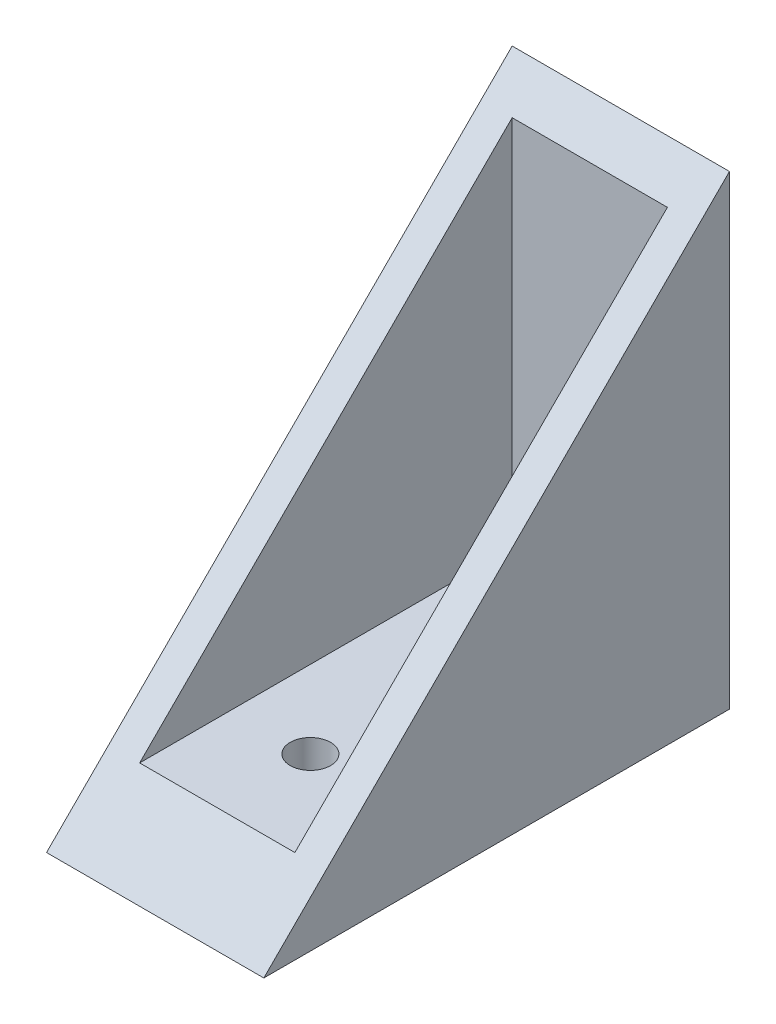
ISO-10303-21;
HEADER;
FILE_DESCRIPTION(('STEP AP214'),'2;1');
FILE_NAME('part.step','',(''),(''),'','','');
FILE_SCHEMA(('AUTOMOTIVE_DESIGN { 1 0 10303 214 1 1 1 1 }'));
ENDSEC;
DATA;
#1=APPLICATION_CONTEXT('core data for automotive mechanical design processes');
#2=APPLICATION_PROTOCOL_DEFINITION('international standard','automotive_design',2000,#1);
#3=PRODUCT_CONTEXT('',#1,'mechanical');
#4=PRODUCT('Part','Part','',(#3));
#5=PRODUCT_RELATED_PRODUCT_CATEGORY('part','',(#4));
#6=PRODUCT_DEFINITION_FORMATION('','',#4);
#7=PRODUCT_DEFINITION_CONTEXT('part definition',#1,'design');
#8=PRODUCT_DEFINITION('design','',#6,#7);
#9=PRODUCT_DEFINITION_SHAPE('','',#8);
#10=(LENGTH_UNIT() NAMED_UNIT(*) SI_UNIT(.MILLI.,.METRE.));
#11=(NAMED_UNIT(*) PLANE_ANGLE_UNIT() SI_UNIT($,.RADIAN.));
#12=(NAMED_UNIT(*) SI_UNIT($,.STERADIAN.) SOLID_ANGLE_UNIT());
#13=UNCERTAINTY_MEASURE_WITH_UNIT(LENGTH_MEASURE(1.E-05),#10,'distance_accuracy_value','');
#14=(GEOMETRIC_REPRESENTATION_CONTEXT(3) GLOBAL_UNCERTAINTY_ASSIGNED_CONTEXT((#13)) GLOBAL_UNIT_ASSIGNED_CONTEXT((#10,
#11,#12)) REPRESENTATION_CONTEXT('',''));
#15=CARTESIAN_POINT('',(0.,0.,0.));
#16=DIRECTION('',(0.,0.,1.));
#17=DIRECTION('',(1.,0.,0.));
#18=AXIS2_PLACEMENT_3D('',#15,#16,#17);
#19=CARTESIAN_POINT('',(17.5,75.,0.));
#20=DIRECTION('',(0.,-0.707106781186548,-0.707106781186548));
#21=DIRECTION('',(0.,0.707106781186548,-0.707106781186548));
#22=AXIS2_PLACEMENT_3D('',#19,#20,#21);
#23=PLANE('',#22);
#24=DIRECTION('',(0.,-0.707106781186548,0.707106781186548));
#25=VECTOR('',#24,1.);
#26=CARTESIAN_POINT('',(-17.5,75.,0.));
#27=LINE('',#26,#25);
#28=CARTESIAN_POINT('',(-17.5,75.,0.));
#29=VERTEX_POINT('',#28);
#30=CARTESIAN_POINT('',(-17.5,0.,75.));
#31=VERTEX_POINT('',#30);
#32=EDGE_CURVE('E80',#29,#31,#27,.T.);
#33=ORIENTED_EDGE('',*,*,#32,.T.);
#34=DIRECTION('',(-1.,0.,0.));
#35=VECTOR('',#34,1.);
#36=CARTESIAN_POINT('',(17.5,0.,75.));
#37=LINE('',#36,#35);
#38=CARTESIAN_POINT('',(17.5,0.,75.));
#39=VERTEX_POINT('',#38);
#40=EDGE_CURVE('E129',#39,#31,#37,.T.);
#41=ORIENTED_EDGE('',*,*,#40,.F.);
#42=DIRECTION('',(0.,-0.707106781186548,0.707106781186548));
#43=VECTOR('',#42,1.);
#44=CARTESIAN_POINT('',(17.5,75.,0.));
#45=LINE('',#44,#43);
#46=CARTESIAN_POINT('',(17.5,75.,0.));
#47=VERTEX_POINT('',#46);
#48=EDGE_CURVE('E63',#47,#39,#45,.T.);
#49=ORIENTED_EDGE('',*,*,#48,.F.);
#50=DIRECTION('',(-1.,0.,0.));
#51=VECTOR('',#50,1.);
#52=CARTESIAN_POINT('',(17.5,75.,0.));
#53=LINE('',#52,#51);
#54=EDGE_CURVE('E136',#47,#29,#53,.T.);
#55=ORIENTED_EDGE('',*,*,#54,.T.);
#56=EDGE_LOOP('',(#33,#41,#49,#55));
#57=FACE_BOUND('',#56,.T.);
#58=DIRECTION('',(-1.,0.,0.));
#59=VECTOR('',#58,1.);
#60=CARTESIAN_POINT('',(17.5,70.,4.99999999999999));
#61=LINE('',#60,#59);
#62=CARTESIAN_POINT('',(12.5,70.,4.99999999999999));
#63=VERTEX_POINT('',#62);
#64=CARTESIAN_POINT('',(-12.5,70.,4.99999999999999));
#65=VERTEX_POINT('',#64);
#66=EDGE_CURVE('E11',#63,#65,#61,.T.);
#67=ORIENTED_EDGE('',*,*,#66,.F.);
#68=DIRECTION('',(0.,0.707106781186548,-0.707106781186548));
#69=VECTOR('',#68,1.);
#70=CARTESIAN_POINT('',(12.5,75.,0.));
#71=LINE('',#70,#69);
#72=CARTESIAN_POINT('',(12.5,10.,65.));
#73=VERTEX_POINT('',#72);
#74=EDGE_CURVE('E107',#73,#63,#71,.T.);
#75=ORIENTED_EDGE('',*,*,#74,.F.);
#76=DIRECTION('',(-1.,0.,0.));
#77=VECTOR('',#76,1.);
#78=CARTESIAN_POINT('',(17.5,9.99999999999999,65.));
#79=LINE('',#78,#77);
#80=CARTESIAN_POINT('',(-12.5,9.99999999999999,65.));
#81=VERTEX_POINT('',#80);
#82=EDGE_CURVE('E117',#73,#81,#79,.T.);
#83=ORIENTED_EDGE('',*,*,#82,.T.);
#84=DIRECTION('',(0.,-0.707106781186548,0.707106781186548));
#85=VECTOR('',#84,1.);
#86=CARTESIAN_POINT('',(-12.5,75.,0.));
#87=LINE('',#86,#85);
#88=EDGE_CURVE('E47',#65,#81,#87,.T.);
#89=ORIENTED_EDGE('',*,*,#88,.F.);
#90=EDGE_LOOP('',(#67,#75,#83,#89));
#91=FACE_BOUND('',#90,.T.);
#92=ADVANCED_FACE('F39',(#57,#91),#23,.F.);
#93=CARTESIAN_POINT('',(17.5,0.,75.));
#94=DIRECTION('',(0.,1.,0.));
#95=DIRECTION('',(0.,0.,1.));
#96=AXIS2_PLACEMENT_3D('',#93,#94,#95);
#97=PLANE('',#96);
#98=CARTESIAN_POINT('',(0.,0.,20.));
#99=DIRECTION('',(0.,1.,0.));
#100=DIRECTION('',(0.,0.,1.));
#101=AXIS2_PLACEMENT_3D('',#98,#99,#100);
#102=CIRCLE('',#101,3.25);
#103=CARTESIAN_POINT('',(0.,0.,23.25));
#104=VERTEX_POINT('',#103);
#105=EDGE_CURVE('E192',#104,#104,#102,.T.);
#106=ORIENTED_EDGE('',*,*,#105,.T.);
#107=EDGE_LOOP('',(#106));
#108=FACE_BOUND('',#107,.T.);
#109=CARTESIAN_POINT('',(0.,0.,50.));
#110=DIRECTION('',(0.,1.,0.));
#111=DIRECTION('',(0.,0.,1.));
#112=AXIS2_PLACEMENT_3D('',#109,#110,#111);
#113=CIRCLE('',#112,3.25);
#114=CARTESIAN_POINT('',(0.,0.,53.25));
#115=VERTEX_POINT('',#114);
#116=EDGE_CURVE('E202',#115,#115,#113,.T.);
#117=ORIENTED_EDGE('',*,*,#116,.T.);
#118=EDGE_LOOP('',(#117));
#119=FACE_BOUND('',#118,.T.);
#120=DIRECTION('',(0.,0.,-1.));
#121=VECTOR('',#120,1.);
#122=CARTESIAN_POINT('',(-17.5,0.,75.));
#123=LINE('',#122,#121);
#124=CARTESIAN_POINT('',(-17.5,0.,0.));
#125=VERTEX_POINT('',#124);
#126=EDGE_CURVE('E111',#31,#125,#123,.T.);
#127=ORIENTED_EDGE('',*,*,#126,.T.);
#128=DIRECTION('',(-1.,0.,0.));
#129=VECTOR('',#128,1.);
#130=CARTESIAN_POINT('',(17.5,0.,0.));
#131=LINE('',#130,#129);
#132=CARTESIAN_POINT('',(17.5,0.,0.));
#133=VERTEX_POINT('',#132);
#134=EDGE_CURVE('E138',#133,#125,#131,.T.);
#135=ORIENTED_EDGE('',*,*,#134,.F.);
#136=DIRECTION('',(0.,0.,-1.));
#137=VECTOR('',#136,1.);
#138=CARTESIAN_POINT('',(17.5,0.,75.));
#139=LINE('',#138,#137);
#140=EDGE_CURVE('E125',#39,#133,#139,.T.);
#141=ORIENTED_EDGE('',*,*,#140,.F.);
#142=ORIENTED_EDGE('',*,*,#40,.T.);
#143=EDGE_LOOP('',(#127,#135,#141,#142));
#144=FACE_BOUND('',#143,.T.);
#145=ADVANCED_FACE('F41',(#108,#119,#144),#97,.F.);
#146=CARTESIAN_POINT('',(17.5,0.,0.));
#147=DIRECTION('',(0.,0.,1.));
#148=DIRECTION('',(1.,0.,0.));
#149=AXIS2_PLACEMENT_3D('',#146,#147,#148);
#150=PLANE('',#149);
#151=DIRECTION('',(0.,1.,0.));
#152=VECTOR('',#151,1.);
#153=CARTESIAN_POINT('',(-17.5,0.,0.));
#154=LINE('',#153,#152);
#155=EDGE_CURVE('E132',#125,#29,#154,.T.);
#156=ORIENTED_EDGE('',*,*,#155,.T.);
#157=ORIENTED_EDGE('',*,*,#54,.F.);
#158=DIRECTION('',(0.,1.,0.));
#159=VECTOR('',#158,1.);
#160=CARTESIAN_POINT('',(17.5,0.,0.));
#161=LINE('',#160,#159);
#162=EDGE_CURVE('E86',#133,#47,#161,.T.);
#163=ORIENTED_EDGE('',*,*,#162,.F.);
#164=ORIENTED_EDGE('',*,*,#134,.T.);
#165=EDGE_LOOP('',(#156,#157,#163,#164));
#166=FACE_BOUND('',#165,.T.);
#167=ADVANCED_FACE('F152',(#166),#150,.F.);
#168=CARTESIAN_POINT('',(17.5,0.,0.));
#169=DIRECTION('',(1.,0.,0.));
#170=DIRECTION('',(0.,0.,-1.));
#171=AXIS2_PLACEMENT_3D('',#168,#169,#170);
#172=PLANE('',#171);
#173=ORIENTED_EDGE('',*,*,#140,.T.);
#174=ORIENTED_EDGE('',*,*,#162,.T.);
#175=ORIENTED_EDGE('',*,*,#48,.T.);
#176=EDGE_LOOP('',(#173,#174,#175));
#177=FACE_BOUND('',#176,.T.);
#178=ADVANCED_FACE('F158',(#177),#172,.T.);
#179=CARTESIAN_POINT('',(-17.5,0.,0.));
#180=DIRECTION('',(1.,0.,0.));
#181=DIRECTION('',(0.,0.,-1.));
#182=AXIS2_PLACEMENT_3D('',#179,#180,#181);
#183=PLANE('',#182);
#184=ORIENTED_EDGE('',*,*,#126,.F.);
#185=ORIENTED_EDGE('',*,*,#32,.F.);
#186=ORIENTED_EDGE('',*,*,#155,.F.);
#187=EDGE_LOOP('',(#184,#185,#186));
#188=FACE_BOUND('',#187,.T.);
#189=ADVANCED_FACE('F155',(#188),#183,.F.);
#190=CARTESIAN_POINT('',(-12.5,75.,75.));
#191=DIRECTION('',(1.,0.,0.));
#192=DIRECTION('',(0.,0.,-1.));
#193=AXIS2_PLACEMENT_3D('',#190,#191,#192);
#194=PLANE('',#193);
#195=ORIENTED_EDGE('',*,*,#88,.T.);
#196=DIRECTION('',(0.,0.,1.));
#197=VECTOR('',#196,1.);
#198=CARTESIAN_POINT('',(-12.5,10.,75.));
#199=LINE('',#198,#197);
#200=CARTESIAN_POINT('',(-12.5,10.,4.99999999999999));
#201=VERTEX_POINT('',#200);
#202=EDGE_CURVE('E54',#201,#81,#199,.T.);
#203=ORIENTED_EDGE('',*,*,#202,.F.);
#204=DIRECTION('',(0.,-1.,0.));
#205=VECTOR('',#204,1.);
#206=CARTESIAN_POINT('',(-12.5,75.,4.99999999999999));
#207=LINE('',#206,#205);
#208=EDGE_CURVE('E112',#65,#201,#207,.T.);
#209=ORIENTED_EDGE('',*,*,#208,.F.);
#210=EDGE_LOOP('',(#195,#203,#209));
#211=FACE_BOUND('',#210,.T.);
#212=ADVANCED_FACE('F143',(#211),#194,.T.);
#213=CARTESIAN_POINT('',(12.5,75.,75.));
#214=DIRECTION('',(-1.,0.,0.));
#215=DIRECTION('',(0.,0.,1.));
#216=AXIS2_PLACEMENT_3D('',#213,#214,#215);
#217=PLANE('',#216);
#218=ORIENTED_EDGE('',*,*,#74,.T.);
#219=DIRECTION('',(0.,-1.,0.));
#220=VECTOR('',#219,1.);
#221=CARTESIAN_POINT('',(12.5,75.,4.99999999999999));
#222=LINE('',#221,#220);
#223=CARTESIAN_POINT('',(12.5,10.,4.99999999999999));
#224=VERTEX_POINT('',#223);
#225=EDGE_CURVE('E102',#63,#224,#222,.T.);
#226=ORIENTED_EDGE('',*,*,#225,.T.);
#227=DIRECTION('',(0.,0.,-1.));
#228=VECTOR('',#227,1.);
#229=CARTESIAN_POINT('',(12.5,10.,75.));
#230=LINE('',#229,#228);
#231=EDGE_CURVE('E105',#73,#224,#230,.T.);
#232=ORIENTED_EDGE('',*,*,#231,.F.);
#233=EDGE_LOOP('',(#218,#226,#232));
#234=FACE_BOUND('',#233,.T.);
#235=ADVANCED_FACE('F104',(#234),#217,.T.);
#236=CARTESIAN_POINT('',(-12.5,75.,4.99999999999999));
#237=DIRECTION('',(0.,0.,1.));
#238=DIRECTION('',(1.,0.,0.));
#239=AXIS2_PLACEMENT_3D('',#236,#237,#238);
#240=PLANE('',#239);
#241=ORIENTED_EDGE('',*,*,#66,.T.);
#242=ORIENTED_EDGE('',*,*,#208,.T.);
#243=DIRECTION('',(-1.,0.,0.));
#244=VECTOR('',#243,1.);
#245=CARTESIAN_POINT('',(-12.5,10.,4.99999999999999));
#246=LINE('',#245,#244);
#247=EDGE_CURVE('E115',#224,#201,#246,.T.);
#248=ORIENTED_EDGE('',*,*,#247,.F.);
#249=ORIENTED_EDGE('',*,*,#225,.F.);
#250=EDGE_LOOP('',(#241,#242,#248,#249));
#251=FACE_BOUND('',#250,.T.);
#252=ADVANCED_FACE('F119',(#251),#240,.T.);
#253=CARTESIAN_POINT('',(0.,10.,0.));
#254=DIRECTION('',(0.,-1.,0.));
#255=DIRECTION('',(0.,0.,-1.));
#256=AXIS2_PLACEMENT_3D('',#253,#254,#255);
#257=PLANE('',#256);
#258=CARTESIAN_POINT('',(0.,10.,20.));
#259=DIRECTION('',(0.,1.,0.));
#260=DIRECTION('',(0.,0.,1.));
#261=AXIS2_PLACEMENT_3D('',#258,#259,#260);
#262=CIRCLE('',#261,3.25);
#263=CARTESIAN_POINT('',(0.,10.,23.25));
#264=VERTEX_POINT('',#263);
#265=EDGE_CURVE('E195',#264,#264,#262,.T.);
#266=ORIENTED_EDGE('',*,*,#265,.F.);
#267=EDGE_LOOP('',(#266));
#268=FACE_BOUND('',#267,.T.);
#269=CARTESIAN_POINT('',(0.,10.,50.));
#270=DIRECTION('',(0.,1.,0.));
#271=DIRECTION('',(0.,0.,1.));
#272=AXIS2_PLACEMENT_3D('',#269,#270,#271);
#273=CIRCLE('',#272,3.25);
#274=CARTESIAN_POINT('',(0.,10.,53.25));
#275=VERTEX_POINT('',#274);
#276=EDGE_CURVE('E197',#275,#275,#273,.T.);
#277=ORIENTED_EDGE('',*,*,#276,.F.);
#278=EDGE_LOOP('',(#277));
#279=FACE_BOUND('',#278,.T.);
#280=ORIENTED_EDGE('',*,*,#231,.T.);
#281=ORIENTED_EDGE('',*,*,#247,.T.);
#282=ORIENTED_EDGE('',*,*,#202,.T.);
#283=ORIENTED_EDGE('',*,*,#82,.F.);
#284=EDGE_LOOP('',(#280,#281,#282,#283));
#285=FACE_BOUND('',#284,.T.);
#286=ADVANCED_FACE('F114',(#268,#279,#285),#257,.F.);
#287=CARTESIAN_POINT('',(0.,10.,50.));
#288=DIRECTION('',(0.,1.,0.));
#289=DIRECTION('',(0.,0.,1.));
#290=AXIS2_PLACEMENT_3D('',#287,#288,#289);
#291=CYLINDRICAL_SURFACE('',#290,3.25);
#292=ORIENTED_EDGE('',*,*,#116,.F.);
#293=EDGE_LOOP('',(#292));
#294=FACE_BOUND('',#293,.T.);
#295=ORIENTED_EDGE('',*,*,#276,.T.);
#296=EDGE_LOOP('',(#295));
#297=FACE_BOUND('',#296,.T.);
#298=ADVANCED_FACE('F179',(#294,#297),#291,.F.);
#299=CARTESIAN_POINT('',(0.,10.,20.));
#300=DIRECTION('',(0.,1.,0.));
#301=DIRECTION('',(0.,0.,1.));
#302=AXIS2_PLACEMENT_3D('',#299,#300,#301);
#303=CYLINDRICAL_SURFACE('',#302,3.25);
#304=ORIENTED_EDGE('',*,*,#105,.F.);
#305=EDGE_LOOP('',(#304));
#306=FACE_BOUND('',#305,.T.);
#307=ORIENTED_EDGE('',*,*,#265,.T.);
#308=EDGE_LOOP('',(#307));
#309=FACE_BOUND('',#308,.T.);
#310=ADVANCED_FACE('F183',(#306,#309),#303,.F.);
#311=CLOSED_SHELL('',(#92,#145,#167,#178,#189,#212,#235,#252,#286,#298,#310));
#312=MANIFOLD_SOLID_BREP('B2',#311);
#313=ADVANCED_BREP_SHAPE_REPRESENTATION('',(#18,#312),#14);
#314=SHAPE_DEFINITION_REPRESENTATION(#9,#313);
ENDSEC;
END-ISO-10303-21;
